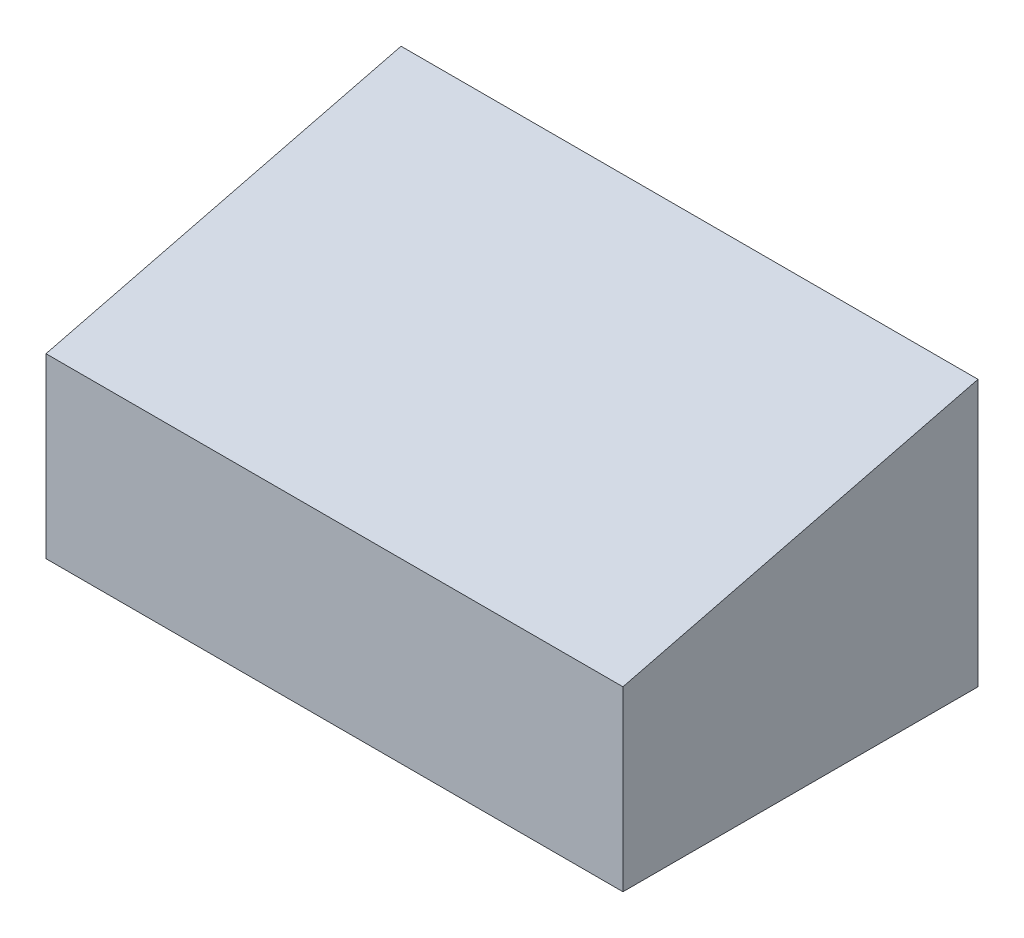
ISO-10303-21;
HEADER;
FILE_DESCRIPTION(('STEP AP214'),'2;1');
FILE_NAME('part.step','',(''),(''),'','','');
FILE_SCHEMA(('AUTOMOTIVE_DESIGN { 1 0 10303 214 1 1 1 1 }'));
ENDSEC;
DATA;
#1=APPLICATION_CONTEXT('core data for automotive mechanical design processes');
#2=APPLICATION_PROTOCOL_DEFINITION('international standard','automotive_design',2000,#1);
#3=PRODUCT_CONTEXT('',#1,'mechanical');
#4=PRODUCT('Part','Part','',(#3));
#5=PRODUCT_RELATED_PRODUCT_CATEGORY('part','',(#4));
#6=PRODUCT_DEFINITION_FORMATION('','',#4);
#7=PRODUCT_DEFINITION_CONTEXT('part definition',#1,'design');
#8=PRODUCT_DEFINITION('design','',#6,#7);
#9=PRODUCT_DEFINITION_SHAPE('','',#8);
#10=(LENGTH_UNIT() NAMED_UNIT(*) SI_UNIT(.MILLI.,.METRE.));
#11=(NAMED_UNIT(*) PLANE_ANGLE_UNIT() SI_UNIT($,.RADIAN.));
#12=(NAMED_UNIT(*) SI_UNIT($,.STERADIAN.) SOLID_ANGLE_UNIT());
#13=UNCERTAINTY_MEASURE_WITH_UNIT(LENGTH_MEASURE(1.E-05),#10,'distance_accuracy_value','');
#14=(GEOMETRIC_REPRESENTATION_CONTEXT(3) GLOBAL_UNCERTAINTY_ASSIGNED_CONTEXT((#13)) GLOBAL_UNIT_ASSIGNED_CONTEXT((#10,
#11,#12)) REPRESENTATION_CONTEXT('',''));
#15=CARTESIAN_POINT('',(0.,0.,0.));
#16=DIRECTION('',(0.,0.,1.));
#17=DIRECTION('',(1.,0.,0.));
#18=AXIS2_PLACEMENT_3D('',#15,#16,#17);
#19=CARTESIAN_POINT('',(65.,60.,-40.));
#20=DIRECTION('',(-1.,0.,0.));
#21=DIRECTION('',(0.,0.,1.));
#22=AXIS2_PLACEMENT_3D('',#19,#20,#21);
#23=PLANE('',#22);
#24=DIRECTION('',(0.,-1.,0.));
#25=VECTOR('',#24,1.);
#26=CARTESIAN_POINT('',(65.,60.,-40.));
#27=LINE('',#26,#25);
#28=CARTESIAN_POINT('',(65.,60.,-40.));
#29=VERTEX_POINT('',#28);
#30=CARTESIAN_POINT('',(65.,0.,-40.));
#31=VERTEX_POINT('',#30);
#32=EDGE_CURVE('E77',#29,#31,#27,.T.);
#33=ORIENTED_EDGE('',*,*,#32,.F.);
#34=DIRECTION('',(0.,-0.24253562503633,0.970142500145333));
#35=VECTOR('',#34,1.);
#36=CARTESIAN_POINT('',(65.,60.,-40.0000000000011));
#37=LINE('',#36,#35);
#38=CARTESIAN_POINT('',(65.,40.,40.));
#39=VERTEX_POINT('',#38);
#40=EDGE_CURVE('E58',#29,#39,#37,.T.);
#41=ORIENTED_EDGE('',*,*,#40,.T.);
#42=DIRECTION('',(0.,-1.,0.));
#43=VECTOR('',#42,1.);
#44=CARTESIAN_POINT('',(65.,60.,40.));
#45=LINE('',#44,#43);
#46=CARTESIAN_POINT('',(65.,0.,40.));
#47=VERTEX_POINT('',#46);
#48=EDGE_CURVE('E86',#39,#47,#45,.T.);
#49=ORIENTED_EDGE('',*,*,#48,.T.);
#50=DIRECTION('',(0.,0.,-1.));
#51=VECTOR('',#50,1.);
#52=CARTESIAN_POINT('',(65.,0.,-40.));
#53=LINE('',#52,#51);
#54=EDGE_CURVE('E90',#47,#31,#53,.T.);
#55=ORIENTED_EDGE('',*,*,#54,.T.);
#56=EDGE_LOOP('',(#33,#41,#49,#55));
#57=FACE_BOUND('',#56,.T.);
#58=ADVANCED_FACE('F35',(#57),#23,.F.);
#59=CARTESIAN_POINT('',(-65.,60.,-40.));
#60=DIRECTION('',(0.,0.,1.));
#61=DIRECTION('',(1.,0.,0.));
#62=AXIS2_PLACEMENT_3D('',#59,#60,#61);
#63=PLANE('',#62);
#64=DIRECTION('',(-1.,0.,0.));
#65=VECTOR('',#64,1.);
#66=CARTESIAN_POINT('',(-65.,0.,-40.));
#67=LINE('',#66,#65);
#68=CARTESIAN_POINT('',(-65.,0.,-40.));
#69=VERTEX_POINT('',#68);
#70=EDGE_CURVE('E102',#31,#69,#67,.T.);
#71=ORIENTED_EDGE('',*,*,#70,.T.);
#72=DIRECTION('',(0.,-1.,0.));
#73=VECTOR('',#72,1.);
#74=CARTESIAN_POINT('',(-65.,60.,-40.));
#75=LINE('',#74,#73);
#76=CARTESIAN_POINT('',(-65.,60.,-40.));
#77=VERTEX_POINT('',#76);
#78=EDGE_CURVE('E85',#77,#69,#75,.T.);
#79=ORIENTED_EDGE('',*,*,#78,.F.);
#80=DIRECTION('',(-1.,0.,0.));
#81=VECTOR('',#80,1.);
#82=CARTESIAN_POINT('',(-65.,60.,-40.));
#83=LINE('',#82,#81);
#84=EDGE_CURVE('E76',#29,#77,#83,.T.);
#85=ORIENTED_EDGE('',*,*,#84,.F.);
#86=ORIENTED_EDGE('',*,*,#32,.T.);
#87=EDGE_LOOP('',(#71,#79,#85,#86));
#88=FACE_BOUND('',#87,.T.);
#89=ADVANCED_FACE('F82',(#88),#63,.F.);
#90=CARTESIAN_POINT('',(-65.,60.,-40.));
#91=DIRECTION('',(1.,0.,0.));
#92=DIRECTION('',(0.,0.,-1.));
#93=AXIS2_PLACEMENT_3D('',#90,#91,#92);
#94=PLANE('',#93);
#95=DIRECTION('',(0.,-1.,0.));
#96=VECTOR('',#95,1.);
#97=CARTESIAN_POINT('',(-65.,60.,40.));
#98=LINE('',#97,#96);
#99=CARTESIAN_POINT('',(-65.,40.,40.));
#100=VERTEX_POINT('',#99);
#101=CARTESIAN_POINT('',(-65.,0.,40.));
#102=VERTEX_POINT('',#101);
#103=EDGE_CURVE('E92',#100,#102,#98,.T.);
#104=ORIENTED_EDGE('',*,*,#103,.F.);
#105=DIRECTION('',(0.,0.24253562503633,-0.970142500145333));
#106=VECTOR('',#105,1.);
#107=CARTESIAN_POINT('',(-65.,60.,-40.0000000000011));
#108=LINE('',#107,#106);
#109=EDGE_CURVE('E11',#100,#77,#108,.T.);
#110=ORIENTED_EDGE('',*,*,#109,.T.);
#111=ORIENTED_EDGE('',*,*,#78,.T.);
#112=DIRECTION('',(0.,0.,1.));
#113=VECTOR('',#112,1.);
#114=CARTESIAN_POINT('',(-65.,0.,-40.));
#115=LINE('',#114,#113);
#116=EDGE_CURVE('E99',#69,#102,#115,.T.);
#117=ORIENTED_EDGE('',*,*,#116,.T.);
#118=EDGE_LOOP('',(#104,#110,#111,#117));
#119=FACE_BOUND('',#118,.T.);
#120=ADVANCED_FACE('F107',(#119),#94,.F.);
#121=CARTESIAN_POINT('',(-65.,60.,40.));
#122=DIRECTION('',(0.,0.,-1.));
#123=DIRECTION('',(-1.,0.,0.));
#124=AXIS2_PLACEMENT_3D('',#121,#122,#123);
#125=PLANE('',#124);
#126=ORIENTED_EDGE('',*,*,#48,.F.);
#127=DIRECTION('',(-1.,0.,0.));
#128=VECTOR('',#127,1.);
#129=CARTESIAN_POINT('',(-65.,40.,40.));
#130=LINE('',#129,#128);
#131=EDGE_CURVE('E44',#39,#100,#130,.T.);
#132=ORIENTED_EDGE('',*,*,#131,.T.);
#133=ORIENTED_EDGE('',*,*,#103,.T.);
#134=DIRECTION('',(1.,0.,0.));
#135=VECTOR('',#134,1.);
#136=CARTESIAN_POINT('',(-65.,0.,40.));
#137=LINE('',#136,#135);
#138=EDGE_CURVE('E87',#102,#47,#137,.T.);
#139=ORIENTED_EDGE('',*,*,#138,.T.);
#140=EDGE_LOOP('',(#126,#132,#133,#139));
#141=FACE_BOUND('',#140,.T.);
#142=ADVANCED_FACE('F110',(#141),#125,.F.);
#143=CARTESIAN_POINT('',(0.,0.,0.));
#144=DIRECTION('',(0.,1.,0.));
#145=DIRECTION('',(0.,0.,1.));
#146=AXIS2_PLACEMENT_3D('',#143,#144,#145);
#147=PLANE('',#146);
#148=ORIENTED_EDGE('',*,*,#54,.F.);
#149=ORIENTED_EDGE('',*,*,#138,.F.);
#150=ORIENTED_EDGE('',*,*,#116,.F.);
#151=ORIENTED_EDGE('',*,*,#70,.F.);
#152=EDGE_LOOP('',(#148,#149,#150,#151));
#153=FACE_BOUND('',#152,.T.);
#154=ADVANCED_FACE('F109',(#153),#147,.F.);
#155=CARTESIAN_POINT('',(0.,60.,-40.0000000000011));
#156=DIRECTION('',(0.,0.970142500145333,0.24253562503633));
#157=DIRECTION('',(-1.,0.,0.));
#158=AXIS2_PLACEMENT_3D('',#155,#156,#157);
#159=PLANE('',#158);
#160=ORIENTED_EDGE('',*,*,#109,.F.);
#161=ORIENTED_EDGE('',*,*,#131,.F.);
#162=ORIENTED_EDGE('',*,*,#40,.F.);
#163=ORIENTED_EDGE('',*,*,#84,.T.);
#164=EDGE_LOOP('',(#160,#161,#162,#163));
#165=FACE_BOUND('',#164,.T.);
#166=ADVANCED_FACE('F38',(#165),#159,.T.);
#167=CLOSED_SHELL('',(#58,#89,#120,#142,#154,#166));
#168=MANIFOLD_SOLID_BREP('B2',#167);
#169=ADVANCED_BREP_SHAPE_REPRESENTATION('',(#18,#168),#14);
#170=SHAPE_DEFINITION_REPRESENTATION(#9,#169);
ENDSEC;
END-ISO-10303-21;
